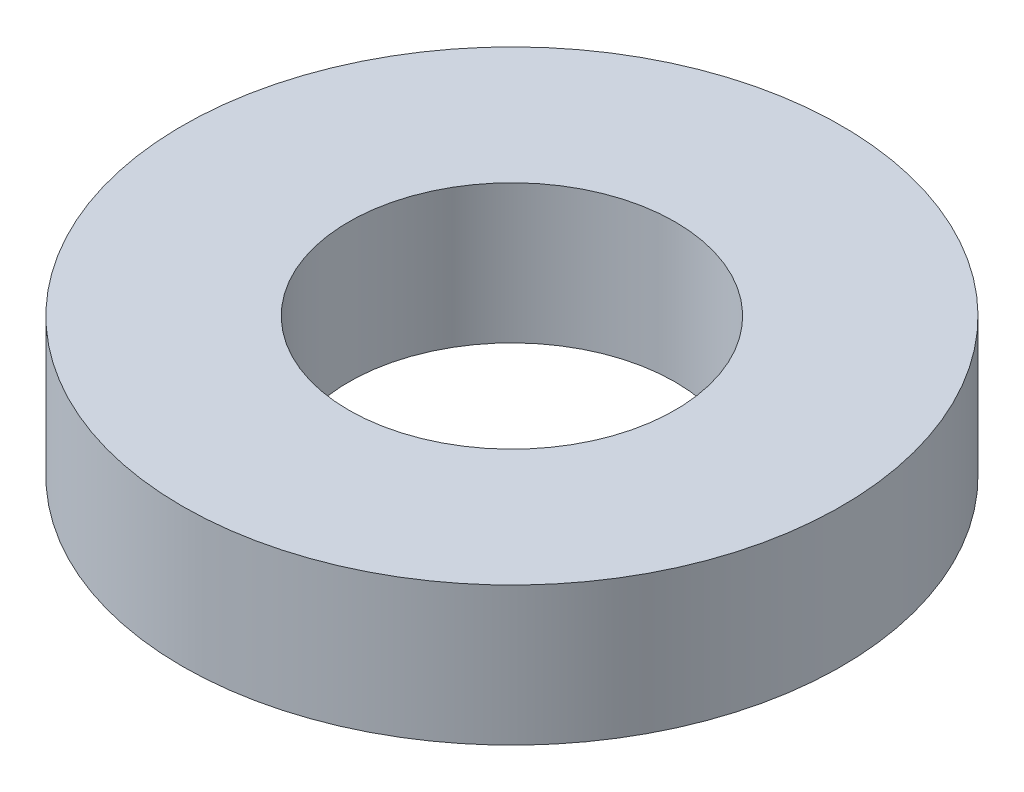
ISO-10303-21;
HEADER;
FILE_DESCRIPTION(('STEP AP214'),'2;1');
FILE_NAME('part.step','',(''),(''),'','','');
FILE_SCHEMA(('AUTOMOTIVE_DESIGN { 1 0 10303 214 1 1 1 1 }'));
ENDSEC;
DATA;
#1=APPLICATION_CONTEXT('core data for automotive mechanical design processes');
#2=APPLICATION_PROTOCOL_DEFINITION('international standard','automotive_design',2000,#1);
#3=PRODUCT_CONTEXT('',#1,'mechanical');
#4=PRODUCT('Part','Part','',(#3));
#5=PRODUCT_RELATED_PRODUCT_CATEGORY('part','',(#4));
#6=PRODUCT_DEFINITION_FORMATION('','',#4);
#7=PRODUCT_DEFINITION_CONTEXT('part definition',#1,'design');
#8=PRODUCT_DEFINITION('design','',#6,#7);
#9=PRODUCT_DEFINITION_SHAPE('','',#8);
#10=(LENGTH_UNIT() NAMED_UNIT(*) SI_UNIT(.MILLI.,.METRE.));
#11=(NAMED_UNIT(*) PLANE_ANGLE_UNIT() SI_UNIT($,.RADIAN.));
#12=(NAMED_UNIT(*) SI_UNIT($,.STERADIAN.) SOLID_ANGLE_UNIT());
#13=UNCERTAINTY_MEASURE_WITH_UNIT(LENGTH_MEASURE(1.E-05),#10,'distance_accuracy_value','');
#14=(GEOMETRIC_REPRESENTATION_CONTEXT(3) GLOBAL_UNCERTAINTY_ASSIGNED_CONTEXT((#13)) GLOBAL_UNIT_ASSIGNED_CONTEXT((#10,
#11,#12)) REPRESENTATION_CONTEXT('',''));
#15=CARTESIAN_POINT('',(0.,0.,0.));
#16=DIRECTION('',(0.,0.,1.));
#17=DIRECTION('',(1.,0.,0.));
#18=AXIS2_PLACEMENT_3D('',#15,#16,#17);
#19=CARTESIAN_POINT('',(0.,17.,0.));
#20=DIRECTION('',(0.,1.,0.));
#21=DIRECTION('',(0.,0.,1.));
#22=AXIS2_PLACEMENT_3D('',#19,#20,#21);
#23=PLANE('',#22);
#24=CARTESIAN_POINT('',(0.,17.,0.));
#25=DIRECTION('',(0.,1.,0.));
#26=DIRECTION('',(0.,0.,1.));
#27=AXIS2_PLACEMENT_3D('',#24,#25,#26);
#28=CIRCLE('',#27,40.4);
#29=CARTESIAN_POINT('',(0.,17.,40.4));
#30=VERTEX_POINT('',#29);
#31=EDGE_CURVE('E11',#30,#30,#28,.T.);
#32=ORIENTED_EDGE('',*,*,#31,.T.);
#33=EDGE_LOOP('',(#32));
#34=FACE_BOUND('',#33,.T.);
#35=CARTESIAN_POINT('',(0.,17.,0.));
#36=DIRECTION('',(0.,1.,0.));
#37=DIRECTION('',(0.,0.,1.));
#38=AXIS2_PLACEMENT_3D('',#35,#36,#37);
#39=CIRCLE('',#38,20.);
#40=CARTESIAN_POINT('',(0.,17.,20.));
#41=VERTEX_POINT('',#40);
#42=EDGE_CURVE('E51',#41,#41,#39,.T.);
#43=ORIENTED_EDGE('',*,*,#42,.F.);
#44=EDGE_LOOP('',(#43));
#45=FACE_BOUND('',#44,.T.);
#46=ADVANCED_FACE('F40',(#34,#45),#23,.T.);
#47=CARTESIAN_POINT('',(0.,0.,0.));
#48=DIRECTION('',(0.,1.,0.));
#49=DIRECTION('',(0.,0.,1.));
#50=AXIS2_PLACEMENT_3D('',#47,#48,#49);
#51=PLANE('',#50);
#52=CARTESIAN_POINT('',(0.,0.,0.));
#53=DIRECTION('',(0.,1.,0.));
#54=DIRECTION('',(0.,0.,1.));
#55=AXIS2_PLACEMENT_3D('',#52,#53,#54);
#56=CIRCLE('',#55,40.4);
#57=CARTESIAN_POINT('',(0.,0.,40.4));
#58=VERTEX_POINT('',#57);
#59=EDGE_CURVE('E44',#58,#58,#56,.T.);
#60=ORIENTED_EDGE('',*,*,#59,.F.);
#61=EDGE_LOOP('',(#60));
#62=FACE_BOUND('',#61,.T.);
#63=CARTESIAN_POINT('',(0.,0.,0.));
#64=DIRECTION('',(0.,1.,0.));
#65=DIRECTION('',(0.,0.,1.));
#66=AXIS2_PLACEMENT_3D('',#63,#64,#65);
#67=CIRCLE('',#66,20.);
#68=CARTESIAN_POINT('',(0.,0.,20.));
#69=VERTEX_POINT('',#68);
#70=EDGE_CURVE('E53',#69,#69,#67,.T.);
#71=ORIENTED_EDGE('',*,*,#70,.T.);
#72=EDGE_LOOP('',(#71));
#73=FACE_BOUND('',#72,.T.);
#74=ADVANCED_FACE('F63',(#62,#73),#51,.F.);
#75=CARTESIAN_POINT('',(0.,17.,0.));
#76=DIRECTION('',(0.,-1.,0.));
#77=DIRECTION('',(0.,0.,-1.));
#78=AXIS2_PLACEMENT_3D('',#75,#76,#77);
#79=CYLINDRICAL_SURFACE('',#78,40.4);
#80=ORIENTED_EDGE('',*,*,#31,.F.);
#81=EDGE_LOOP('',(#80));
#82=FACE_BOUND('',#81,.T.);
#83=ORIENTED_EDGE('',*,*,#59,.T.);
#84=EDGE_LOOP('',(#83));
#85=FACE_BOUND('',#84,.T.);
#86=ADVANCED_FACE('F42',(#82,#85),#79,.T.);
#87=CARTESIAN_POINT('',(0.,17.,0.));
#88=DIRECTION('',(0.,-1.,0.));
#89=DIRECTION('',(0.,0.,-1.));
#90=AXIS2_PLACEMENT_3D('',#87,#88,#89);
#91=CYLINDRICAL_SURFACE('',#90,20.);
#92=ORIENTED_EDGE('',*,*,#42,.T.);
#93=EDGE_LOOP('',(#92));
#94=FACE_BOUND('',#93,.T.);
#95=ORIENTED_EDGE('',*,*,#70,.F.);
#96=EDGE_LOOP('',(#95));
#97=FACE_BOUND('',#96,.T.);
#98=ADVANCED_FACE('F59',(#94,#97),#91,.F.);
#99=CLOSED_SHELL('',(#46,#74,#86,#98));
#100=MANIFOLD_SOLID_BREP('B2',#99);
#101=ADVANCED_BREP_SHAPE_REPRESENTATION('',(#18,#100),#14);
#102=SHAPE_DEFINITION_REPRESENTATION(#9,#101);
ENDSEC;
END-ISO-10303-21;
